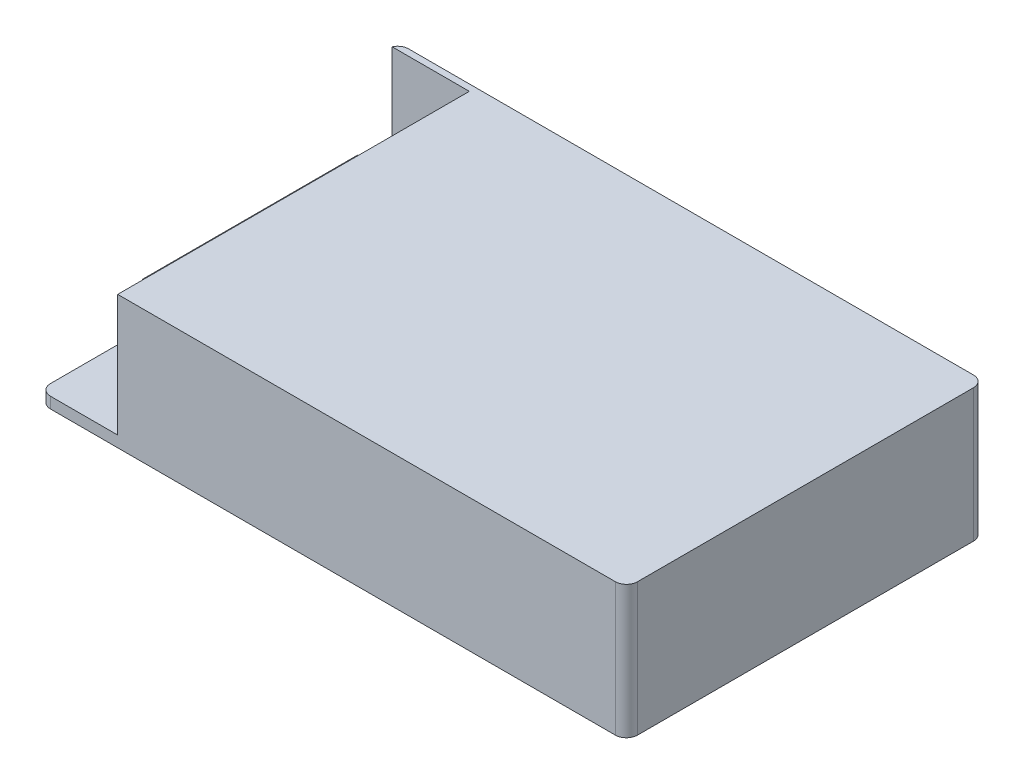
ISO-10303-21;
HEADER;
FILE_DESCRIPTION(('STEP AP214'),'2;1');
FILE_NAME('part.step','',(''),(''),'','','');
FILE_SCHEMA(('AUTOMOTIVE_DESIGN { 1 0 10303 214 1 1 1 1 }'));
ENDSEC;
DATA;
#1=APPLICATION_CONTEXT('core data for automotive mechanical design processes');
#2=APPLICATION_PROTOCOL_DEFINITION('international standard','automotive_design',2000,#1);
#3=PRODUCT_CONTEXT('',#1,'mechanical');
#4=PRODUCT('Part','Part','',(#3));
#5=PRODUCT_RELATED_PRODUCT_CATEGORY('part','',(#4));
#6=PRODUCT_DEFINITION_FORMATION('','',#4);
#7=PRODUCT_DEFINITION_CONTEXT('part definition',#1,'design');
#8=PRODUCT_DEFINITION('design','',#6,#7);
#9=PRODUCT_DEFINITION_SHAPE('','',#8);
#10=(LENGTH_UNIT() NAMED_UNIT(*) SI_UNIT(.MILLI.,.METRE.));
#11=(NAMED_UNIT(*) PLANE_ANGLE_UNIT() SI_UNIT($,.RADIAN.));
#12=(NAMED_UNIT(*) SI_UNIT($,.STERADIAN.) SOLID_ANGLE_UNIT());
#13=UNCERTAINTY_MEASURE_WITH_UNIT(LENGTH_MEASURE(1.E-05),#10,'distance_accuracy_value','');
#14=(GEOMETRIC_REPRESENTATION_CONTEXT(3) GLOBAL_UNCERTAINTY_ASSIGNED_CONTEXT((#13)) GLOBAL_UNIT_ASSIGNED_CONTEXT((#10,
#11,#12)) REPRESENTATION_CONTEXT('',''));
#15=CARTESIAN_POINT('',(0.,0.,0.));
#16=DIRECTION('',(0.,0.,1.));
#17=DIRECTION('',(1.,0.,0.));
#18=AXIS2_PLACEMENT_3D('',#15,#16,#17);
#19=CARTESIAN_POINT('',(-79.5,15.,-37.7044971877989));
#20=DIRECTION('',(1.,0.,0.));
#21=DIRECTION('',(0.,0.,-1.));
#22=AXIS2_PLACEMENT_3D('',#19,#20,#21);
#23=PLANE('',#22);
#24=DIRECTION('',(0.,0.,1.));
#25=VECTOR('',#24,1.);
#26=CARTESIAN_POINT('',(-79.5,3.,-37.7044971877989));
#27=LINE('',#26,#25);
#28=CARTESIAN_POINT('',(-79.5,3.,-37.7044971877989));
#29=VERTEX_POINT('',#28);
#30=CARTESIAN_POINT('',(-79.5,3.,20.5839109430793));
#31=VERTEX_POINT('',#30);
#32=EDGE_CURVE('E108',#29,#31,#27,.T.);
#33=ORIENTED_EDGE('',*,*,#32,.T.);
#34=DIRECTION('',(0.,-1.,0.));
#35=VECTOR('',#34,1.);
#36=CARTESIAN_POINT('',(-79.5,15.,20.5839109430793));
#37=LINE('',#36,#35);
#38=CARTESIAN_POINT('',(-79.5,15.,20.5839109430793));
#39=VERTEX_POINT('',#38);
#40=EDGE_CURVE('E12',#39,#31,#37,.T.);
#41=ORIENTED_EDGE('',*,*,#40,.F.);
#42=DIRECTION('',(0.,0.,1.));
#43=VECTOR('',#42,1.);
#44=CARTESIAN_POINT('',(-79.5,15.,-37.7044971877989));
#45=LINE('',#44,#43);
#46=CARTESIAN_POINT('',(-79.5,15.,-37.7044971877989));
#47=VERTEX_POINT('',#46);
#48=EDGE_CURVE('E96',#47,#39,#45,.T.);
#49=ORIENTED_EDGE('',*,*,#48,.F.);
#50=DIRECTION('',(0.,-1.,0.));
#51=VECTOR('',#50,1.);
#52=CARTESIAN_POINT('',(-79.5,15.,-37.7044971877989));
#53=LINE('',#52,#51);
#54=EDGE_CURVE('E104',#47,#29,#53,.T.);
#55=ORIENTED_EDGE('',*,*,#54,.T.);
#56=EDGE_LOOP('',(#33,#41,#49,#55));
#57=FACE_BOUND('',#56,.T.);
#58=ADVANCED_FACE('F45',(#57),#23,.F.);
#59=CARTESIAN_POINT('',(-79.5,15.,20.5839109430793));
#60=DIRECTION('',(0.,0.,-1.));
#61=DIRECTION('',(-1.,0.,0.));
#62=AXIS2_PLACEMENT_3D('',#59,#60,#61);
#63=PLANE('',#62);
#64=DIRECTION('',(1.,0.,0.));
#65=VECTOR('',#64,1.);
#66=CARTESIAN_POINT('',(-79.5,3.,20.5839109430793));
#67=LINE('',#66,#65);
#68=CARTESIAN_POINT('',(-58.313885011473,3.,20.5839109430793));
#69=VERTEX_POINT('',#68);
#70=EDGE_CURVE('E100',#31,#69,#67,.T.);
#71=ORIENTED_EDGE('',*,*,#70,.T.);
#72=DIRECTION('',(0.,-1.,0.));
#73=VECTOR('',#72,1.);
#74=CARTESIAN_POINT('',(-58.313885011473,15.,20.5839109430793));
#75=LINE('',#74,#73);
#76=CARTESIAN_POINT('',(-58.313885011473,15.,20.5839109430793));
#77=VERTEX_POINT('',#76);
#78=EDGE_CURVE('E53',#77,#69,#75,.T.);
#79=ORIENTED_EDGE('',*,*,#78,.F.);
#80=DIRECTION('',(1.,0.,0.));
#81=VECTOR('',#80,1.);
#82=CARTESIAN_POINT('',(-79.5,15.,20.5839109430793));
#83=LINE('',#82,#81);
#84=EDGE_CURVE('E91',#39,#77,#83,.T.);
#85=ORIENTED_EDGE('',*,*,#84,.F.);
#86=ORIENTED_EDGE('',*,*,#40,.T.);
#87=EDGE_LOOP('',(#71,#79,#85,#86));
#88=FACE_BOUND('',#87,.T.);
#89=ADVANCED_FACE('F99',(#88),#63,.F.);
#90=CARTESIAN_POINT('',(-58.313885011473,15.,-37.7044971877989));
#91=DIRECTION('',(-1.,0.,0.));
#92=DIRECTION('',(0.,0.,1.));
#93=AXIS2_PLACEMENT_3D('',#90,#91,#92);
#94=PLANE('',#93);
#95=DIRECTION('',(0.,0.,-1.));
#96=VECTOR('',#95,1.);
#97=CARTESIAN_POINT('',(-58.313885011473,3.,-37.7044971877989));
#98=LINE('',#97,#96);
#99=CARTESIAN_POINT('',(-58.313885011473,3.,-37.7044971877989));
#100=VERTEX_POINT('',#99);
#101=EDGE_CURVE('E78',#69,#100,#98,.T.);
#102=ORIENTED_EDGE('',*,*,#101,.T.);
#103=DIRECTION('',(0.,-1.,0.));
#104=VECTOR('',#103,1.);
#105=CARTESIAN_POINT('',(-58.313885011473,15.,-37.7044971877989));
#106=LINE('',#105,#104);
#107=CARTESIAN_POINT('',(-58.313885011473,15.,-37.7044971877989));
#108=VERTEX_POINT('',#107);
#109=EDGE_CURVE('E101',#108,#100,#106,.T.);
#110=ORIENTED_EDGE('',*,*,#109,.F.);
#111=DIRECTION('',(0.,0.,-1.));
#112=VECTOR('',#111,1.);
#113=CARTESIAN_POINT('',(-58.313885011473,15.,-37.7044971877989));
#114=LINE('',#113,#112);
#115=EDGE_CURVE('E94',#77,#108,#114,.T.);
#116=ORIENTED_EDGE('',*,*,#115,.F.);
#117=ORIENTED_EDGE('',*,*,#78,.T.);
#118=EDGE_LOOP('',(#102,#110,#116,#117));
#119=FACE_BOUND('',#118,.T.);
#120=ADVANCED_FACE('F102',(#119),#94,.F.);
#121=CARTESIAN_POINT('',(-79.5,15.,-37.7044971877989));
#122=DIRECTION('',(0.,0.,1.));
#123=DIRECTION('',(1.,0.,0.));
#124=AXIS2_PLACEMENT_3D('',#121,#122,#123);
#125=PLANE('',#124);
#126=DIRECTION('',(-1.,0.,0.));
#127=VECTOR('',#126,1.);
#128=CARTESIAN_POINT('',(-79.5,3.,-37.7044971877989));
#129=LINE('',#128,#127);
#130=EDGE_CURVE('E84',#100,#29,#129,.T.);
#131=ORIENTED_EDGE('',*,*,#130,.T.);
#132=ORIENTED_EDGE('',*,*,#54,.F.);
#133=DIRECTION('',(-1.,0.,0.));
#134=VECTOR('',#133,1.);
#135=CARTESIAN_POINT('',(-79.5,15.,-37.7044971877989));
#136=LINE('',#135,#134);
#137=EDGE_CURVE('E61',#108,#47,#136,.T.);
#138=ORIENTED_EDGE('',*,*,#137,.F.);
#139=ORIENTED_EDGE('',*,*,#109,.T.);
#140=EDGE_LOOP('',(#131,#132,#138,#139));
#141=FACE_BOUND('',#140,.T.);
#142=ADVANCED_FACE('F115',(#141),#125,.F.);
#143=CARTESIAN_POINT('',(0.,15.,0.));
#144=DIRECTION('',(0.,1.,0.));
#145=DIRECTION('',(0.,0.,1.));
#146=AXIS2_PLACEMENT_3D('',#143,#144,#145);
#147=PLANE('',#146);
#148=ORIENTED_EDGE('',*,*,#48,.T.);
#149=ORIENTED_EDGE('',*,*,#84,.T.);
#150=ORIENTED_EDGE('',*,*,#115,.T.);
#151=ORIENTED_EDGE('',*,*,#137,.T.);
#152=EDGE_LOOP('',(#148,#149,#150,#151));
#153=FACE_BOUND('',#152,.T.);
#154=ADVANCED_FACE('F92',(#153),#147,.T.);
#155=CARTESIAN_POINT('',(0.,3.,0.));
#156=DIRECTION('',(0.,1.,0.));
#157=DIRECTION('',(0.,0.,1.));
#158=AXIS2_PLACEMENT_3D('',#155,#156,#157);
#159=PLANE('',#158);
#160=ORIENTED_EDGE('',*,*,#32,.F.);
#161=ORIENTED_EDGE('',*,*,#130,.F.);
#162=ORIENTED_EDGE('',*,*,#101,.F.);
#163=ORIENTED_EDGE('',*,*,#70,.F.);
#164=EDGE_LOOP('',(#160,#161,#162,#163));
#165=FACE_BOUND('',#164,.T.);
#166=ADVANCED_FACE('F118',(#165),#159,.F.);
#167=CLOSED_SHELL('',(#58,#89,#120,#142,#154,#166));
#168=MANIFOLD_SOLID_BREP('B2',#167);
#169=CARTESIAN_POINT('',(-79.5,36.,-45.5));
#170=DIRECTION('',(1.,0.,0.));
#171=DIRECTION('',(0.,0.,-1.));
#172=AXIS2_PLACEMENT_3D('',#169,#170,#171);
#173=PLANE('',#172);
#174=DIRECTION('',(0.,0.,1.));
#175=VECTOR('',#174,1.);
#176=CARTESIAN_POINT('',(-79.5,3.,-45.5));
#177=LINE('',#176,#175);
#178=CARTESIAN_POINT('',(-79.5,3.,-45.5));
#179=VERTEX_POINT('',#178);
#180=CARTESIAN_POINT('',(-79.5,3.,45.5));
#181=VERTEX_POINT('',#180);
#182=EDGE_CURVE('E317',#179,#181,#177,.T.);
#183=ORIENTED_EDGE('',*,*,#182,.F.);
#184=DIRECTION('',(0.,-1.,0.));
#185=VECTOR('',#184,1.);
#186=CARTESIAN_POINT('',(-79.5,36.,-45.5));
#187=LINE('',#186,#185);
#188=CARTESIAN_POINT('',(-79.5,0.,-45.5));
#189=VERTEX_POINT('',#188);
#190=EDGE_CURVE('E295',#179,#189,#187,.T.);
#191=ORIENTED_EDGE('',*,*,#190,.T.);
#192=DIRECTION('',(0.,0.,1.));
#193=VECTOR('',#192,1.);
#194=CARTESIAN_POINT('',(-79.5,0.,-45.5));
#195=LINE('',#194,#193);
#196=CARTESIAN_POINT('',(-79.5,0.,45.5));
#197=VERTEX_POINT('',#196);
#198=EDGE_CURVE('E282',#189,#197,#195,.T.);
#199=ORIENTED_EDGE('',*,*,#198,.T.);
#200=DIRECTION('',(0.,-1.,0.));
#201=VECTOR('',#200,1.);
#202=CARTESIAN_POINT('',(-79.5,36.,45.5));
#203=LINE('',#202,#201);
#204=EDGE_CURVE('E293',#181,#197,#203,.T.);
#205=ORIENTED_EDGE('',*,*,#204,.F.);
#206=EDGE_LOOP('',(#183,#191,#199,#205));
#207=FACE_BOUND('',#206,.T.);
#208=ADVANCED_FACE('F169',(#207),#173,.F.);
#209=CARTESIAN_POINT('',(-76.5,36.,45.5));
#210=DIRECTION('',(0.,-1.,0.));
#211=DIRECTION('',(0.,0.,-1.));
#212=AXIS2_PLACEMENT_3D('',#209,#210,#211);
#213=CYLINDRICAL_SURFACE('',#212,3.00000000000001);
#214=CARTESIAN_POINT('',(-76.5,3.,45.5));
#215=DIRECTION('',(0.,1.,0.));
#216=DIRECTION('',(0.,0.,1.));
#217=AXIS2_PLACEMENT_3D('',#214,#215,#216);
#218=CIRCLE('',#217,3.00000000000001);
#219=CARTESIAN_POINT('',(-76.5,3.,48.5));
#220=VERTEX_POINT('',#219);
#221=EDGE_CURVE('E320',#181,#220,#218,.T.);
#222=ORIENTED_EDGE('',*,*,#221,.F.);
#223=ORIENTED_EDGE('',*,*,#204,.T.);
#224=CARTESIAN_POINT('',(-76.5,0.,45.5));
#225=DIRECTION('',(0.,1.,0.));
#226=DIRECTION('',(0.,0.,1.));
#227=AXIS2_PLACEMENT_3D('',#224,#225,#226);
#228=CIRCLE('',#227,3.00000000000001);
#229=CARTESIAN_POINT('',(-76.5,0.,48.5));
#230=VERTEX_POINT('',#229);
#231=EDGE_CURVE('E285',#197,#230,#228,.T.);
#232=ORIENTED_EDGE('',*,*,#231,.T.);
#233=DIRECTION('',(0.,-1.,0.));
#234=VECTOR('',#233,1.);
#235=CARTESIAN_POINT('',(-76.5,36.,48.5));
#236=LINE('',#235,#234);
#237=EDGE_CURVE('E291',#220,#230,#236,.T.);
#238=ORIENTED_EDGE('',*,*,#237,.F.);
#239=EDGE_LOOP('',(#222,#223,#232,#238));
#240=FACE_BOUND('',#239,.T.);
#241=ADVANCED_FACE('F368',(#240),#213,.T.);
#242=CARTESIAN_POINT('',(76.5,36.,45.5));
#243=DIRECTION('',(0.,-1.,0.));
#244=DIRECTION('',(0.,0.,-1.));
#245=AXIS2_PLACEMENT_3D('',#242,#243,#244);
#246=CYLINDRICAL_SURFACE('',#245,3.);
#247=CARTESIAN_POINT('',(76.5,0.,45.5));
#248=DIRECTION('',(0.,1.,0.));
#249=DIRECTION('',(0.,0.,-1.));
#250=AXIS2_PLACEMENT_3D('',#247,#248,#249);
#251=CIRCLE('',#250,3.);
#252=CARTESIAN_POINT('',(76.5,0.,48.5));
#253=VERTEX_POINT('',#252);
#254=CARTESIAN_POINT('',(79.5,0.,45.5));
#255=VERTEX_POINT('',#254);
#256=EDGE_CURVE('E270',#253,#255,#251,.T.);
#257=ORIENTED_EDGE('',*,*,#256,.T.);
#258=DIRECTION('',(0.,-1.,0.));
#259=VECTOR('',#258,1.);
#260=CARTESIAN_POINT('',(79.5,36.,45.5));
#261=LINE('',#260,#259);
#262=CARTESIAN_POINT('',(79.5,36.,45.5));
#263=VERTEX_POINT('',#262);
#264=EDGE_CURVE('E299',#263,#255,#261,.T.);
#265=ORIENTED_EDGE('',*,*,#264,.F.);
#266=CARTESIAN_POINT('',(76.5,36.,45.5));
#267=DIRECTION('',(0.,1.,0.));
#268=DIRECTION('',(0.,0.,-1.));
#269=AXIS2_PLACEMENT_3D('',#266,#267,#268);
#270=CIRCLE('',#269,3.);
#271=CARTESIAN_POINT('',(76.5,36.,48.5));
#272=VERTEX_POINT('',#271);
#273=EDGE_CURVE('E289',#272,#263,#270,.T.);
#274=ORIENTED_EDGE('',*,*,#273,.F.);
#275=DIRECTION('',(0.,-1.,0.));
#276=VECTOR('',#275,1.);
#277=CARTESIAN_POINT('',(76.5,36.,48.5));
#278=LINE('',#277,#276);
#279=EDGE_CURVE('E269',#272,#253,#278,.T.);
#280=ORIENTED_EDGE('',*,*,#279,.T.);
#281=EDGE_LOOP('',(#257,#265,#274,#280));
#282=FACE_BOUND('',#281,.T.);
#283=ADVANCED_FACE('F171',(#282),#246,.T.);
#284=CARTESIAN_POINT('',(79.5,36.,-45.5));
#285=DIRECTION('',(-1.,0.,0.));
#286=DIRECTION('',(0.,0.,1.));
#287=AXIS2_PLACEMENT_3D('',#284,#285,#286);
#288=PLANE('',#287);
#289=DIRECTION('',(0.,0.,-1.));
#290=VECTOR('',#289,1.);
#291=CARTESIAN_POINT('',(79.5,0.,-45.5));
#292=LINE('',#291,#290);
#293=CARTESIAN_POINT('',(79.5,0.,-45.5));
#294=VERTEX_POINT('',#293);
#295=EDGE_CURVE('E273',#255,#294,#292,.T.);
#296=ORIENTED_EDGE('',*,*,#295,.T.);
#297=DIRECTION('',(0.,-1.,0.));
#298=VECTOR('',#297,1.);
#299=CARTESIAN_POINT('',(79.5,36.,-45.5));
#300=LINE('',#299,#298);
#301=CARTESIAN_POINT('',(79.5,36.,-45.5));
#302=VERTEX_POINT('',#301);
#303=EDGE_CURVE('E257',#302,#294,#300,.T.);
#304=ORIENTED_EDGE('',*,*,#303,.F.);
#305=DIRECTION('',(0.,0.,-1.));
#306=VECTOR('',#305,1.);
#307=CARTESIAN_POINT('',(79.5,36.,-45.5));
#308=LINE('',#307,#306);
#309=EDGE_CURVE('E234',#263,#302,#308,.T.);
#310=ORIENTED_EDGE('',*,*,#309,.F.);
#311=ORIENTED_EDGE('',*,*,#264,.T.);
#312=EDGE_LOOP('',(#296,#304,#310,#311));
#313=FACE_BOUND('',#312,.T.);
#314=ADVANCED_FACE('F375',(#313),#288,.F.);
#315=CARTESIAN_POINT('',(76.5,36.,-45.5));
#316=DIRECTION('',(0.,-1.,0.));
#317=DIRECTION('',(0.,0.,-1.));
#318=AXIS2_PLACEMENT_3D('',#315,#316,#317);
#319=CYLINDRICAL_SURFACE('',#318,3.00000000000001);
#320=CARTESIAN_POINT('',(76.5,0.,-45.5));
#321=DIRECTION('',(0.,1.,0.));
#322=DIRECTION('',(0.,0.,1.));
#323=AXIS2_PLACEMENT_3D('',#320,#321,#322);
#324=CIRCLE('',#323,3.00000000000001);
#325=CARTESIAN_POINT('',(76.5,0.,-48.5));
#326=VERTEX_POINT('',#325);
#327=EDGE_CURVE('E254',#294,#326,#324,.T.);
#328=ORIENTED_EDGE('',*,*,#327,.T.);
#329=DIRECTION('',(0.,-1.,0.));
#330=VECTOR('',#329,1.);
#331=CARTESIAN_POINT('',(76.5,36.,-48.5));
#332=LINE('',#331,#330);
#333=CARTESIAN_POINT('',(76.5,36.,-48.5));
#334=VERTEX_POINT('',#333);
#335=EDGE_CURVE('E251',#334,#326,#332,.T.);
#336=ORIENTED_EDGE('',*,*,#335,.F.);
#337=CARTESIAN_POINT('',(76.5,36.,-45.5));
#338=DIRECTION('',(0.,1.,0.));
#339=DIRECTION('',(0.,0.,1.));
#340=AXIS2_PLACEMENT_3D('',#337,#338,#339);
#341=CIRCLE('',#340,3.00000000000001);
#342=EDGE_CURVE('E240',#302,#334,#341,.T.);
#343=ORIENTED_EDGE('',*,*,#342,.F.);
#344=ORIENTED_EDGE('',*,*,#303,.T.);
#345=EDGE_LOOP('',(#328,#336,#343,#344));
#346=FACE_BOUND('',#345,.T.);
#347=ADVANCED_FACE('F252',(#346),#319,.T.);
#348=CARTESIAN_POINT('',(-76.5,36.,-48.5));
#349=DIRECTION('',(0.,0.,1.));
#350=DIRECTION('',(1.,0.,0.));
#351=AXIS2_PLACEMENT_3D('',#348,#349,#350);
#352=PLANE('',#351);
#353=DIRECTION('',(-1.,0.,0.));
#354=VECTOR('',#353,1.);
#355=CARTESIAN_POINT('',(-76.5,0.,-48.5));
#356=LINE('',#355,#354);
#357=CARTESIAN_POINT('',(-76.5,0.,-48.5));
#358=VERTEX_POINT('',#357);
#359=EDGE_CURVE('E277',#326,#358,#356,.T.);
#360=ORIENTED_EDGE('',*,*,#359,.T.);
#361=DIRECTION('',(0.,-1.,0.));
#362=VECTOR('',#361,1.);
#363=CARTESIAN_POINT('',(-76.5,36.,-48.5));
#364=LINE('',#363,#362);
#365=CARTESIAN_POINT('',(-76.5,36.,-48.5));
#366=VERTEX_POINT('',#365);
#367=EDGE_CURVE('E258',#366,#358,#364,.T.);
#368=ORIENTED_EDGE('',*,*,#367,.F.);
#369=DIRECTION('',(-1.,0.,0.));
#370=VECTOR('',#369,1.);
#371=CARTESIAN_POINT('',(-76.5,36.,-48.5));
#372=LINE('',#371,#370);
#373=EDGE_CURVE('E245',#334,#366,#372,.T.);
#374=ORIENTED_EDGE('',*,*,#373,.F.);
#375=ORIENTED_EDGE('',*,*,#335,.T.);
#376=EDGE_LOOP('',(#360,#368,#374,#375));
#377=FACE_BOUND('',#376,.T.);
#378=ADVANCED_FACE('F260',(#377),#352,.F.);
#379=CARTESIAN_POINT('',(-76.5,36.,-45.5));
#380=DIRECTION('',(0.,-1.,0.));
#381=DIRECTION('',(0.,0.,-1.));
#382=AXIS2_PLACEMENT_3D('',#379,#380,#381);
#383=CYLINDRICAL_SURFACE('',#382,3.);
#384=CARTESIAN_POINT('',(-76.5,3.,-45.5));
#385=DIRECTION('',(0.,1.,0.));
#386=DIRECTION('',(0.,0.,1.));
#387=AXIS2_PLACEMENT_3D('',#384,#385,#386);
#388=CIRCLE('',#387,3.);
#389=CARTESIAN_POINT('',(-79.2243885453174,3.,-46.7560680929566));
#390=VERTEX_POINT('',#389);
#391=EDGE_CURVE('E274',#390,#179,#388,.T.);
#392=ORIENTED_EDGE('',*,*,#391,.F.);
#393=DIRECTION('',(0.,-1.,0.));
#394=VECTOR('',#393,1.);
#395=CARTESIAN_POINT('',(-79.2243885453174,36.,-46.7560680929566));
#396=LINE('',#395,#394);
#397=CARTESIAN_POINT('',(-79.2243885453174,36.,-46.7560680929566));
#398=VERTEX_POINT('',#397);
#399=EDGE_CURVE('E323',#390,#398,#396,.F.);
#400=ORIENTED_EDGE('',*,*,#399,.T.);
#401=CARTESIAN_POINT('',(-76.5,36.,-45.5));
#402=DIRECTION('',(0.,1.,0.));
#403=DIRECTION('',(0.,0.,-1.));
#404=AXIS2_PLACEMENT_3D('',#401,#402,#403);
#405=CIRCLE('',#404,3.);
#406=EDGE_CURVE('E263',#366,#398,#405,.T.);
#407=ORIENTED_EDGE('',*,*,#406,.F.);
#408=ORIENTED_EDGE('',*,*,#367,.T.);
#409=CARTESIAN_POINT('',(-76.5,0.,-45.5));
#410=DIRECTION('',(0.,1.,0.));
#411=DIRECTION('',(0.,0.,-1.));
#412=AXIS2_PLACEMENT_3D('',#409,#410,#411);
#413=CIRCLE('',#412,3.);
#414=EDGE_CURVE('E279',#358,#189,#413,.T.);
#415=ORIENTED_EDGE('',*,*,#414,.T.);
#416=ORIENTED_EDGE('',*,*,#190,.F.);
#417=EDGE_LOOP('',(#392,#400,#407,#408,#415,#416));
#418=FACE_BOUND('',#417,.T.);
#419=ADVANCED_FACE('F350',(#418),#383,.T.);
#420=CARTESIAN_POINT('',(-76.5,36.,48.5));
#421=DIRECTION('',(0.,0.,-1.));
#422=DIRECTION('',(-1.,0.,0.));
#423=AXIS2_PLACEMENT_3D('',#420,#421,#422);
#424=PLANE('',#423);
#425=DIRECTION('',(1.,0.,0.));
#426=VECTOR('',#425,1.);
#427=CARTESIAN_POINT('',(-76.5,36.,48.5));
#428=LINE('',#427,#426);
#429=CARTESIAN_POINT('',(-58.313885011473,36.,48.5));
#430=VERTEX_POINT('',#429);
#431=EDGE_CURVE('E192',#430,#272,#428,.T.);
#432=ORIENTED_EDGE('',*,*,#431,.F.);
#433=DIRECTION('',(0.,-1.,0.));
#434=VECTOR('',#433,1.);
#435=CARTESIAN_POINT('',(-58.313885011473,36.,48.5));
#436=LINE('',#435,#434);
#437=CARTESIAN_POINT('',(-58.313885011473,3.,48.5));
#438=VERTEX_POINT('',#437);
#439=EDGE_CURVE('E184',#430,#438,#436,.T.);
#440=ORIENTED_EDGE('',*,*,#439,.T.);
#441=DIRECTION('',(1.,0.,0.));
#442=VECTOR('',#441,1.);
#443=CARTESIAN_POINT('',(-76.5,3.,48.5));
#444=LINE('',#443,#442);
#445=EDGE_CURVE('E43',#220,#438,#444,.T.);
#446=ORIENTED_EDGE('',*,*,#445,.F.);
#447=ORIENTED_EDGE('',*,*,#237,.T.);
#448=DIRECTION('',(1.,0.,0.));
#449=VECTOR('',#448,1.);
#450=CARTESIAN_POINT('',(-76.5,0.,48.5));
#451=LINE('',#450,#449);
#452=EDGE_CURVE('E225',#230,#253,#451,.T.);
#453=ORIENTED_EDGE('',*,*,#452,.T.);
#454=ORIENTED_EDGE('',*,*,#279,.F.);
#455=EDGE_LOOP('',(#432,#440,#446,#447,#453,#454));
#456=FACE_BOUND('',#455,.T.);
#457=ADVANCED_FACE('F306',(#456),#424,.F.);
#458=CARTESIAN_POINT('',(76.5,36.,45.5));
#459=DIRECTION('',(0.,-1.,0.));
#460=DIRECTION('',(0.,0.,-1.));
#461=AXIS2_PLACEMENT_3D('',#458,#459,#460);
#462=PLANE('',#461);
#463=ORIENTED_EDGE('',*,*,#406,.T.);
#464=DIRECTION('',(-1.,0.,0.));
#465=VECTOR('',#464,1.);
#466=CARTESIAN_POINT('',(-83.4066526373224,36.,-46.7560680929566));
#467=LINE('',#466,#465);
#468=CARTESIAN_POINT('',(-58.313885011473,36.,-46.7560680929566));
#469=VERTEX_POINT('',#468);
#470=EDGE_CURVE('E303',#469,#398,#467,.T.);
#471=ORIENTED_EDGE('',*,*,#470,.F.);
#472=DIRECTION('',(0.,0.,1.));
#473=VECTOR('',#472,1.);
#474=CARTESIAN_POINT('',(-58.313885011473,36.,45.5));
#475=LINE('',#474,#473);
#476=EDGE_CURVE('E177',#469,#430,#475,.T.);
#477=ORIENTED_EDGE('',*,*,#476,.T.);
#478=ORIENTED_EDGE('',*,*,#431,.T.);
#479=ORIENTED_EDGE('',*,*,#273,.T.);
#480=ORIENTED_EDGE('',*,*,#309,.T.);
#481=ORIENTED_EDGE('',*,*,#342,.T.);
#482=ORIENTED_EDGE('',*,*,#373,.T.);
#483=EDGE_LOOP('',(#463,#471,#477,#478,#479,#480,#481,#482));
#484=FACE_BOUND('',#483,.T.);
#485=ADVANCED_FACE('F243',(#484),#462,.F.);
#486=CARTESIAN_POINT('',(76.5,0.,45.5));
#487=DIRECTION('',(0.,-1.,0.));
#488=DIRECTION('',(0.,0.,-1.));
#489=AXIS2_PLACEMENT_3D('',#486,#487,#488);
#490=PLANE('',#489);
#491=ORIENTED_EDGE('',*,*,#256,.F.);
#492=ORIENTED_EDGE('',*,*,#452,.F.);
#493=ORIENTED_EDGE('',*,*,#231,.F.);
#494=ORIENTED_EDGE('',*,*,#198,.F.);
#495=ORIENTED_EDGE('',*,*,#414,.F.);
#496=ORIENTED_EDGE('',*,*,#359,.F.);
#497=ORIENTED_EDGE('',*,*,#327,.F.);
#498=ORIENTED_EDGE('',*,*,#295,.F.);
#499=EDGE_LOOP('',(#491,#492,#493,#494,#495,#496,#497,#498));
#500=FACE_BOUND('',#499,.T.);
#501=ADVANCED_FACE('F365',(#500),#490,.T.);
#502=CARTESIAN_POINT('',(0.,3.,0.));
#503=DIRECTION('',(0.,1.,0.));
#504=DIRECTION('',(0.,0.,1.));
#505=AXIS2_PLACEMENT_3D('',#502,#503,#504);
#506=PLANE('',#505);
#507=ORIENTED_EDGE('',*,*,#391,.T.);
#508=ORIENTED_EDGE('',*,*,#182,.T.);
#509=ORIENTED_EDGE('',*,*,#221,.T.);
#510=ORIENTED_EDGE('',*,*,#445,.T.);
#511=DIRECTION('',(0.,0.,-1.));
#512=VECTOR('',#511,1.);
#513=CARTESIAN_POINT('',(-58.313885011473,3.,-46.7560680929566));
#514=LINE('',#513,#512);
#515=CARTESIAN_POINT('',(-58.313885011473,3.,-46.7560680929566));
#516=VERTEX_POINT('',#515);
#517=EDGE_CURVE('E331',#438,#516,#514,.T.);
#518=ORIENTED_EDGE('',*,*,#517,.T.);
#519=DIRECTION('',(-1.,0.,0.));
#520=VECTOR('',#519,1.);
#521=CARTESIAN_POINT('',(-83.4066526373224,3.,-46.7560680929566));
#522=LINE('',#521,#520);
#523=EDGE_CURVE('E329',#516,#390,#522,.T.);
#524=ORIENTED_EDGE('',*,*,#523,.T.);
#525=EDGE_LOOP('',(#507,#508,#509,#510,#518,#524));
#526=FACE_BOUND('',#525,.T.);
#527=ADVANCED_FACE('F337',(#526),#506,.T.);
#528=CARTESIAN_POINT('',(-83.4066526373224,3.,-46.7560680929566));
#529=DIRECTION('',(0.,0.,-1.));
#530=DIRECTION('',(-1.,0.,0.));
#531=AXIS2_PLACEMENT_3D('',#528,#529,#530);
#532=PLANE('',#531);
#533=ORIENTED_EDGE('',*,*,#523,.F.);
#534=DIRECTION('',(0.,1.,0.));
#535=VECTOR('',#534,1.);
#536=CARTESIAN_POINT('',(-58.313885011473,3.,-46.7560680929566));
#537=LINE('',#536,#535);
#538=EDGE_CURVE('E327',#516,#469,#537,.T.);
#539=ORIENTED_EDGE('',*,*,#538,.T.);
#540=ORIENTED_EDGE('',*,*,#470,.T.);
#541=ORIENTED_EDGE('',*,*,#399,.F.);
#542=EDGE_LOOP('',(#533,#539,#540,#541));
#543=FACE_BOUND('',#542,.T.);
#544=ADVANCED_FACE('F345',(#543),#532,.F.);
#545=CARTESIAN_POINT('',(-58.313885011473,3.,-46.7560680929566));
#546=DIRECTION('',(1.,0.,0.));
#547=DIRECTION('',(0.,0.,-1.));
#548=AXIS2_PLACEMENT_3D('',#545,#546,#547);
#549=PLANE('',#548);
#550=ORIENTED_EDGE('',*,*,#476,.F.);
#551=ORIENTED_EDGE('',*,*,#538,.F.);
#552=ORIENTED_EDGE('',*,*,#517,.F.);
#553=ORIENTED_EDGE('',*,*,#439,.F.);
#554=EDGE_LOOP('',(#550,#551,#552,#553));
#555=FACE_BOUND('',#554,.T.);
#556=ADVANCED_FACE('F342',(#555),#549,.F.);
#557=CLOSED_SHELL('',(#208,#241,#283,#314,#347,#378,#419,#457,#485,#501,#527,#544,#556));
#558=MANIFOLD_SOLID_BREP('B6',#557);
#559=ADVANCED_BREP_SHAPE_REPRESENTATION('',(#18,#168,#558),#14);
#560=SHAPE_DEFINITION_REPRESENTATION(#9,#559);
ENDSEC;
END-ISO-10303-21;
